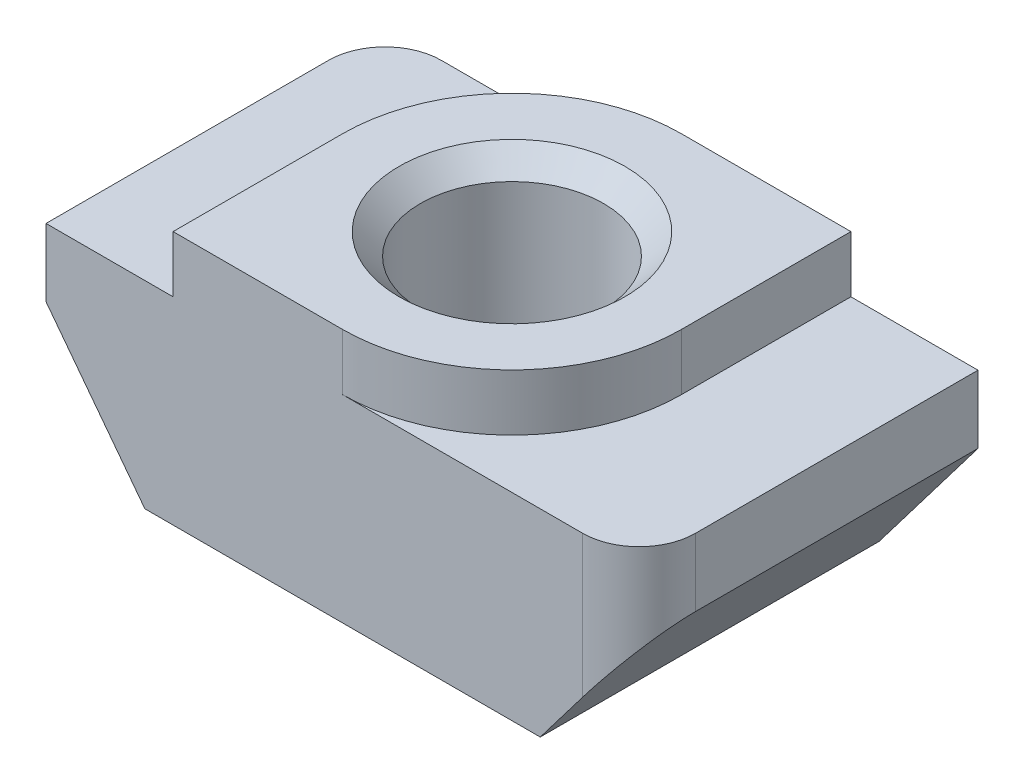
ISO-10303-21;
HEADER;
FILE_DESCRIPTION(('STEP AP214'),'2;1');
FILE_NAME('part.step','',(''),(''),'','','');
FILE_SCHEMA(('AUTOMOTIVE_DESIGN { 1 0 10303 214 1 1 1 1 }'));
ENDSEC;
DATA;
#1=APPLICATION_CONTEXT('core data for automotive mechanical design processes');
#2=APPLICATION_PROTOCOL_DEFINITION('international standard','automotive_design',2000,#1);
#3=PRODUCT_CONTEXT('',#1,'mechanical');
#4=PRODUCT('Part','Part','',(#3));
#5=PRODUCT_RELATED_PRODUCT_CATEGORY('part','',(#4));
#6=PRODUCT_DEFINITION_FORMATION('','',#4);
#7=PRODUCT_DEFINITION_CONTEXT('part definition',#1,'design');
#8=PRODUCT_DEFINITION('design','',#6,#7);
#9=PRODUCT_DEFINITION_SHAPE('','',#8);
#10=(LENGTH_UNIT() NAMED_UNIT(*) SI_UNIT(.MILLI.,.METRE.));
#11=(NAMED_UNIT(*) PLANE_ANGLE_UNIT() SI_UNIT($,.RADIAN.));
#12=(NAMED_UNIT(*) SI_UNIT($,.STERADIAN.) SOLID_ANGLE_UNIT());
#13=UNCERTAINTY_MEASURE_WITH_UNIT(LENGTH_MEASURE(1.E-05),#10,'distance_accuracy_value','');
#14=(GEOMETRIC_REPRESENTATION_CONTEXT(3) GLOBAL_UNCERTAINTY_ASSIGNED_CONTEXT((#13)) GLOBAL_UNIT_ASSIGNED_CONTEXT((#10,
#11,#12)) REPRESENTATION_CONTEXT('',''));
#15=CARTESIAN_POINT('',(0.,0.,0.));
#16=DIRECTION('',(0.,0.,1.));
#17=DIRECTION('',(1.,0.,0.));
#18=AXIS2_PLACEMENT_3D('',#15,#16,#17);
#19=CARTESIAN_POINT('',(-5.25,0.,3.));
#20=DIRECTION('',(1.,0.,0.));
#21=DIRECTION('',(0.,0.,-1.));
#22=AXIS2_PLACEMENT_3D('',#19,#20,#21);
#23=PLANE('',#22);
#24=DIRECTION('',(0.,1.,0.));
#25=VECTOR('',#24,1.);
#26=CARTESIAN_POINT('',(-5.25,0.,-2.));
#27=LINE('',#26,#25);
#28=CARTESIAN_POINT('',(-5.25,-1.2,-2.));
#29=VERTEX_POINT('',#28);
#30=CARTESIAN_POINT('',(-5.25,0.,-2.));
#31=VERTEX_POINT('',#30);
#32=EDGE_CURVE('E212',#29,#31,#27,.T.);
#33=ORIENTED_EDGE('',*,*,#32,.F.);
#34=DIRECTION('',(0.,0.,1.));
#35=VECTOR('',#34,1.);
#36=CARTESIAN_POINT('',(-5.25,-1.2,3.));
#37=LINE('',#36,#35);
#38=CARTESIAN_POINT('',(-5.25,-1.2,3.));
#39=VERTEX_POINT('',#38);
#40=EDGE_CURVE('E155',#29,#39,#37,.T.);
#41=ORIENTED_EDGE('',*,*,#40,.T.);
#42=DIRECTION('',(0.,1.,0.));
#43=VECTOR('',#42,1.);
#44=CARTESIAN_POINT('',(-5.25,0.,3.));
#45=LINE('',#44,#43);
#46=CARTESIAN_POINT('',(-5.25,0.,3.));
#47=VERTEX_POINT('',#46);
#48=EDGE_CURVE('E144',#47,#39,#45,.F.);
#49=ORIENTED_EDGE('',*,*,#48,.F.);
#50=DIRECTION('',(0.,0.,-1.));
#51=VECTOR('',#50,1.);
#52=CARTESIAN_POINT('',(-5.25,0.,3.));
#53=LINE('',#52,#51);
#54=EDGE_CURVE('E134',#47,#31,#53,.T.);
#55=ORIENTED_EDGE('',*,*,#54,.T.);
#56=EDGE_LOOP('',(#33,#41,#49,#55));
#57=FACE_BOUND('',#56,.T.);
#58=ADVANCED_FACE('F16',(#57),#23,.F.);
#59=CARTESIAN_POINT('',(4.25,0.,2.));
#60=DIRECTION('',(0.,1.,0.));
#61=DIRECTION('',(0.,0.,1.));
#62=AXIS2_PLACEMENT_3D('',#59,#60,#61);
#63=CYLINDRICAL_SURFACE('',#62,1.);
#64=CARTESIAN_POINT('',(4.25,0.,2.));
#65=DIRECTION('',(0.,1.,0.));
#66=DIRECTION('',(0.,0.,1.));
#67=AXIS2_PLACEMENT_3D('',#64,#65,#66);
#68=CIRCLE('',#67,1.);
#69=CARTESIAN_POINT('',(5.25,0.,2.));
#70=VERTEX_POINT('',#69);
#71=CARTESIAN_POINT('',(4.25,0.,3.));
#72=VERTEX_POINT('',#71);
#73=EDGE_CURVE('E19',#70,#72,#68,.F.);
#74=ORIENTED_EDGE('',*,*,#73,.T.);
#75=DIRECTION('',(0.,1.,0.));
#76=VECTOR('',#75,1.);
#77=CARTESIAN_POINT('',(4.25,0.,3.));
#78=LINE('',#77,#76);
#79=CARTESIAN_POINT('',(4.25,-2.51428571428572,3.));
#80=VERTEX_POINT('',#79);
#81=EDGE_CURVE('E152',#80,#72,#78,.T.);
#82=ORIENTED_EDGE('',*,*,#81,.F.);
#83=CARTESIAN_POINT('',(4.25,-2.51428571428572,2.));
#84=DIRECTION('',(-0.795828694120859,0.605521832483263,0.));
#85=DIRECTION('',(0.605521832483263,0.795828694120859,0.));
#86=AXIS2_PLACEMENT_3D('',#83,#84,#85);
#87=ELLIPSE('',#86,1.65146811618496,1.);
#88=CARTESIAN_POINT('',(5.25,-1.2,2.));
#89=VERTEX_POINT('',#88);
#90=EDGE_CURVE('E119',#80,#89,#87,.T.);
#91=ORIENTED_EDGE('',*,*,#90,.T.);
#92=DIRECTION('',(0.,1.,0.));
#93=VECTOR('',#92,1.);
#94=CARTESIAN_POINT('',(5.25,-1.2,2.));
#95=LINE('',#94,#93);
#96=EDGE_CURVE('E114',#89,#70,#95,.T.);
#97=ORIENTED_EDGE('',*,*,#96,.T.);
#98=EDGE_LOOP('',(#74,#82,#91,#97));
#99=FACE_BOUND('',#98,.T.);
#100=ADVANCED_FACE('F116',(#99),#63,.T.);
#101=CARTESIAN_POINT('',(5.25,-1.2,3.));
#102=DIRECTION('',(-1.,0.,0.));
#103=DIRECTION('',(0.,0.,1.));
#104=AXIS2_PLACEMENT_3D('',#101,#102,#103);
#105=PLANE('',#104);
#106=ORIENTED_EDGE('',*,*,#96,.F.);
#107=DIRECTION('',(0.,0.,1.));
#108=VECTOR('',#107,1.);
#109=CARTESIAN_POINT('',(5.25,-1.2,3.));
#110=LINE('',#109,#108);
#111=CARTESIAN_POINT('',(5.25,-1.2,-3.));
#112=VERTEX_POINT('',#111);
#113=EDGE_CURVE('E149',#89,#112,#110,.F.);
#114=ORIENTED_EDGE('',*,*,#113,.T.);
#115=DIRECTION('',(0.,1.,0.));
#116=VECTOR('',#115,1.);
#117=CARTESIAN_POINT('',(5.25,-1.2,-3.));
#118=LINE('',#117,#116);
#119=CARTESIAN_POINT('',(5.25,0.,-3.));
#120=VERTEX_POINT('',#119);
#121=EDGE_CURVE('E125',#120,#112,#118,.F.);
#122=ORIENTED_EDGE('',*,*,#121,.F.);
#123=DIRECTION('',(0.,0.,-1.));
#124=VECTOR('',#123,1.);
#125=CARTESIAN_POINT('',(5.25,0.,3.));
#126=LINE('',#125,#124);
#127=EDGE_CURVE('E124',#120,#70,#126,.F.);
#128=ORIENTED_EDGE('',*,*,#127,.T.);
#129=EDGE_LOOP('',(#106,#114,#122,#128));
#130=FACE_BOUND('',#129,.T.);
#131=ADVANCED_FACE('F135',(#130),#105,.F.);
#132=CARTESIAN_POINT('',(5.25,0.,3.));
#133=DIRECTION('',(0.,-1.,0.));
#134=DIRECTION('',(0.,0.,-1.));
#135=AXIS2_PLACEMENT_3D('',#132,#133,#134);
#136=PLANE('',#135);
#137=ORIENTED_EDGE('',*,*,#73,.F.);
#138=ORIENTED_EDGE('',*,*,#127,.F.);
#139=DIRECTION('',(1.,0.,0.));
#140=VECTOR('',#139,1.);
#141=CARTESIAN_POINT('',(0.,0.,-3.));
#142=LINE('',#141,#140);
#143=CARTESIAN_POINT('',(3.,0.,-3.));
#144=VERTEX_POINT('',#143);
#145=EDGE_CURVE('E148',#120,#144,#142,.F.);
#146=ORIENTED_EDGE('',*,*,#145,.T.);
#147=DIRECTION('',(0.,0.,1.));
#148=VECTOR('',#147,1.);
#149=CARTESIAN_POINT('',(3.,0.,0.));
#150=LINE('',#149,#148);
#151=CARTESIAN_POINT('',(3.,0.,0.));
#152=VERTEX_POINT('',#151);
#153=EDGE_CURVE('E208',#144,#152,#150,.T.);
#154=ORIENTED_EDGE('',*,*,#153,.T.);
#155=CARTESIAN_POINT('',(0.,0.,0.));
#156=DIRECTION('',(0.,1.,0.));
#157=DIRECTION('',(0.,0.,1.));
#158=AXIS2_PLACEMENT_3D('',#155,#156,#157);
#159=CIRCLE('',#158,3.);
#160=CARTESIAN_POINT('',(0.,0.,3.));
#161=VERTEX_POINT('',#160);
#162=EDGE_CURVE('E171',#161,#152,#159,.T.);
#163=ORIENTED_EDGE('',*,*,#162,.F.);
#164=DIRECTION('',(1.,0.,0.));
#165=VECTOR('',#164,1.);
#166=CARTESIAN_POINT('',(0.,0.,3.));
#167=LINE('',#166,#165);
#168=EDGE_CURVE('E133',#72,#161,#167,.F.);
#169=ORIENTED_EDGE('',*,*,#168,.F.);
#170=EDGE_LOOP('',(#137,#138,#146,#154,#163,#169));
#171=FACE_BOUND('',#170,.T.);
#172=ADVANCED_FACE('F129',(#171),#136,.F.);
#173=CARTESIAN_POINT('',(5.25,0.,3.));
#174=DIRECTION('',(0.,-1.,0.));
#175=DIRECTION('',(0.,0.,-1.));
#176=AXIS2_PLACEMENT_3D('',#173,#174,#175);
#177=PLANE('',#176);
#178=CARTESIAN_POINT('',(-4.25,0.,-2.));
#179=DIRECTION('',(0.,1.,0.));
#180=DIRECTION('',(0.,0.,1.));
#181=AXIS2_PLACEMENT_3D('',#178,#179,#180);
#182=CIRCLE('',#181,1.);
#183=CARTESIAN_POINT('',(-4.25,0.,-3.));
#184=VERTEX_POINT('',#183);
#185=EDGE_CURVE('E213',#31,#184,#182,.F.);
#186=ORIENTED_EDGE('',*,*,#185,.F.);
#187=ORIENTED_EDGE('',*,*,#54,.F.);
#188=DIRECTION('',(1.,0.,0.));
#189=VECTOR('',#188,1.);
#190=CARTESIAN_POINT('',(0.,0.,3.));
#191=LINE('',#190,#189);
#192=CARTESIAN_POINT('',(-3.,0.,3.));
#193=VERTEX_POINT('',#192);
#194=EDGE_CURVE('E175',#193,#47,#191,.F.);
#195=ORIENTED_EDGE('',*,*,#194,.F.);
#196=DIRECTION('',(0.,0.,-1.));
#197=VECTOR('',#196,1.);
#198=CARTESIAN_POINT('',(-3.,0.,0.));
#199=LINE('',#198,#197);
#200=CARTESIAN_POINT('',(-3.,0.,0.));
#201=VERTEX_POINT('',#200);
#202=EDGE_CURVE('E168',#193,#201,#199,.T.);
#203=ORIENTED_EDGE('',*,*,#202,.T.);
#204=CARTESIAN_POINT('',(0.,0.,0.));
#205=DIRECTION('',(0.,1.,0.));
#206=DIRECTION('',(0.,0.,1.));
#207=AXIS2_PLACEMENT_3D('',#204,#205,#206);
#208=CIRCLE('',#207,3.);
#209=CARTESIAN_POINT('',(0.,0.,-3.));
#210=VERTEX_POINT('',#209);
#211=EDGE_CURVE('E211',#210,#201,#208,.T.);
#212=ORIENTED_EDGE('',*,*,#211,.F.);
#213=DIRECTION('',(1.,0.,0.));
#214=VECTOR('',#213,1.);
#215=CARTESIAN_POINT('',(0.,0.,-3.));
#216=LINE('',#215,#214);
#217=EDGE_CURVE('E225',#210,#184,#216,.F.);
#218=ORIENTED_EDGE('',*,*,#217,.T.);
#219=EDGE_LOOP('',(#186,#187,#195,#203,#212,#218));
#220=FACE_BOUND('',#219,.T.);
#221=ADVANCED_FACE('F296',(#220),#177,.F.);
#222=CARTESIAN_POINT('',(-4.25,0.,-2.));
#223=DIRECTION('',(0.,1.,0.));
#224=DIRECTION('',(0.,0.,1.));
#225=AXIS2_PLACEMENT_3D('',#222,#223,#224);
#226=CYLINDRICAL_SURFACE('',#225,1.);
#227=CARTESIAN_POINT('',(-4.25,-2.51428571428571,-2.));
#228=DIRECTION('',(0.795828694120859,0.605521832483263,0.));
#229=DIRECTION('',(-0.605521832483263,0.795828694120859,0.));
#230=AXIS2_PLACEMENT_3D('',#227,#228,#229);
#231=ELLIPSE('',#230,1.65146811618496,1.);
#232=CARTESIAN_POINT('',(-4.25,-2.51428571428572,-3.));
#233=VERTEX_POINT('',#232);
#234=EDGE_CURVE('E205',#233,#29,#231,.T.);
#235=ORIENTED_EDGE('',*,*,#234,.T.);
#236=ORIENTED_EDGE('',*,*,#32,.T.);
#237=ORIENTED_EDGE('',*,*,#185,.T.);
#238=DIRECTION('',(0.,1.,0.));
#239=VECTOR('',#238,1.);
#240=CARTESIAN_POINT('',(-4.25,0.,-3.));
#241=LINE('',#240,#239);
#242=EDGE_CURVE('E254',#184,#233,#241,.F.);
#243=ORIENTED_EDGE('',*,*,#242,.T.);
#244=EDGE_LOOP('',(#235,#236,#237,#243));
#245=FACE_BOUND('',#244,.T.);
#246=ADVANCED_FACE('F437',(#245),#226,.T.);
#247=CARTESIAN_POINT('',(0.,1.,0.));
#248=DIRECTION('',(0.,1.,0.));
#249=DIRECTION('',(0.,0.,1.));
#250=AXIS2_PLACEMENT_3D('',#247,#248,#249);
#251=CYLINDRICAL_SURFACE('',#250,3.);
#252=CARTESIAN_POINT('',(0.,1.,0.));
#253=DIRECTION('',(0.,1.,0.));
#254=DIRECTION('',(0.,0.,1.));
#255=AXIS2_PLACEMENT_3D('',#252,#253,#254);
#256=CIRCLE('',#255,3.);
#257=CARTESIAN_POINT('',(0.,1.,-3.));
#258=VERTEX_POINT('',#257);
#259=CARTESIAN_POINT('',(-3.,1.,0.));
#260=VERTEX_POINT('',#259);
#261=EDGE_CURVE('E200',#258,#260,#256,.T.);
#262=ORIENTED_EDGE('',*,*,#261,.F.);
#263=DIRECTION('',(0.,1.,0.));
#264=VECTOR('',#263,1.);
#265=CARTESIAN_POINT('',(0.,0.,-3.));
#266=LINE('',#265,#264);
#267=EDGE_CURVE('E233',#258,#210,#266,.F.);
#268=ORIENTED_EDGE('',*,*,#267,.T.);
#269=ORIENTED_EDGE('',*,*,#211,.T.);
#270=DIRECTION('',(0.,1.,0.));
#271=VECTOR('',#270,1.);
#272=CARTESIAN_POINT('',(-3.,1.,0.));
#273=LINE('',#272,#271);
#274=EDGE_CURVE('E172',#201,#260,#273,.T.);
#275=ORIENTED_EDGE('',*,*,#274,.T.);
#276=EDGE_LOOP('',(#262,#268,#269,#275));
#277=FACE_BOUND('',#276,.T.);
#278=ADVANCED_FACE('F302',(#277),#251,.T.);
#279=CARTESIAN_POINT('',(-3.,1.,0.));
#280=DIRECTION('',(1.,0.,0.));
#281=DIRECTION('',(0.,0.,-1.));
#282=AXIS2_PLACEMENT_3D('',#279,#280,#281);
#283=PLANE('',#282);
#284=DIRECTION('',(0.,1.,0.));
#285=VECTOR('',#284,1.);
#286=CARTESIAN_POINT('',(-3.,0.,3.));
#287=LINE('',#286,#285);
#288=CARTESIAN_POINT('',(-3.,1.,3.));
#289=VERTEX_POINT('',#288);
#290=EDGE_CURVE('E179',#289,#193,#287,.F.);
#291=ORIENTED_EDGE('',*,*,#290,.F.);
#292=DIRECTION('',(0.,0.,1.));
#293=VECTOR('',#292,1.);
#294=CARTESIAN_POINT('',(-3.,1.,0.));
#295=LINE('',#294,#293);
#296=EDGE_CURVE('E202',#260,#289,#295,.T.);
#297=ORIENTED_EDGE('',*,*,#296,.F.);
#298=ORIENTED_EDGE('',*,*,#274,.F.);
#299=ORIENTED_EDGE('',*,*,#202,.F.);
#300=EDGE_LOOP('',(#291,#297,#298,#299));
#301=FACE_BOUND('',#300,.T.);
#302=ADVANCED_FACE('F337',(#301),#283,.F.);
#303=CARTESIAN_POINT('',(0.,1.,0.));
#304=DIRECTION('',(0.,1.,0.));
#305=DIRECTION('',(0.,0.,1.));
#306=AXIS2_PLACEMENT_3D('',#303,#304,#305);
#307=CYLINDRICAL_SURFACE('',#306,3.);
#308=CARTESIAN_POINT('',(0.,1.,0.));
#309=DIRECTION('',(0.,1.,0.));
#310=DIRECTION('',(0.,0.,1.));
#311=AXIS2_PLACEMENT_3D('',#308,#309,#310);
#312=CIRCLE('',#311,3.);
#313=CARTESIAN_POINT('',(0.,1.,3.));
#314=VERTEX_POINT('',#313);
#315=CARTESIAN_POINT('',(3.,1.,0.));
#316=VERTEX_POINT('',#315);
#317=EDGE_CURVE('E196',#314,#316,#312,.T.);
#318=ORIENTED_EDGE('',*,*,#317,.F.);
#319=DIRECTION('',(0.,1.,0.));
#320=VECTOR('',#319,1.);
#321=CARTESIAN_POINT('',(0.,0.,3.));
#322=LINE('',#321,#320);
#323=EDGE_CURVE('E183',#161,#314,#322,.T.);
#324=ORIENTED_EDGE('',*,*,#323,.F.);
#325=ORIENTED_EDGE('',*,*,#162,.T.);
#326=DIRECTION('',(0.,1.,0.));
#327=VECTOR('',#326,1.);
#328=CARTESIAN_POINT('',(3.,1.,0.));
#329=LINE('',#328,#327);
#330=EDGE_CURVE('E210',#152,#316,#329,.T.);
#331=ORIENTED_EDGE('',*,*,#330,.T.);
#332=EDGE_LOOP('',(#318,#324,#325,#331));
#333=FACE_BOUND('',#332,.T.);
#334=ADVANCED_FACE('F326',(#333),#307,.T.);
#335=CARTESIAN_POINT('',(3.,1.,0.));
#336=DIRECTION('',(-1.,0.,0.));
#337=DIRECTION('',(0.,0.,1.));
#338=AXIS2_PLACEMENT_3D('',#335,#336,#337);
#339=PLANE('',#338);
#340=DIRECTION('',(0.,1.,0.));
#341=VECTOR('',#340,1.);
#342=CARTESIAN_POINT('',(3.,0.,-3.));
#343=LINE('',#342,#341);
#344=CARTESIAN_POINT('',(3.,1.,-3.));
#345=VERTEX_POINT('',#344);
#346=EDGE_CURVE('E231',#144,#345,#343,.T.);
#347=ORIENTED_EDGE('',*,*,#346,.T.);
#348=DIRECTION('',(0.,0.,1.));
#349=VECTOR('',#348,1.);
#350=CARTESIAN_POINT('',(3.,1.,0.));
#351=LINE('',#350,#349);
#352=EDGE_CURVE('E198',#316,#345,#351,.F.);
#353=ORIENTED_EDGE('',*,*,#352,.F.);
#354=ORIENTED_EDGE('',*,*,#330,.F.);
#355=ORIENTED_EDGE('',*,*,#153,.F.);
#356=EDGE_LOOP('',(#347,#353,#354,#355));
#357=FACE_BOUND('',#356,.T.);
#358=ADVANCED_FACE('F328',(#357),#339,.F.);
#359=CARTESIAN_POINT('',(-5.25,-1.2,3.));
#360=DIRECTION('',(0.795828694120859,0.605521832483263,0.));
#361=DIRECTION('',(-0.605521832483263,0.795828694120859,0.));
#362=AXIS2_PLACEMENT_3D('',#359,#360,#361);
#363=PLANE('',#362);
#364=ORIENTED_EDGE('',*,*,#234,.F.);
#365=DIRECTION('',(0.605521832483265,-0.795828694120857,0.));
#366=VECTOR('',#365,1.);
#367=CARTESIAN_POINT('',(-4.25,-2.51428571428572,-3.));
#368=LINE('',#367,#366);
#369=CARTESIAN_POINT('',(-3.5,-3.5,-3.));
#370=VERTEX_POINT('',#369);
#371=EDGE_CURVE('E203',#233,#370,#368,.T.);
#372=ORIENTED_EDGE('',*,*,#371,.T.);
#373=DIRECTION('',(0.,0.,1.));
#374=VECTOR('',#373,1.);
#375=CARTESIAN_POINT('',(-3.5,-3.5,3.));
#376=LINE('',#375,#374);
#377=CARTESIAN_POINT('',(-3.5,-3.5,3.));
#378=VERTEX_POINT('',#377);
#379=EDGE_CURVE('E165',#370,#378,#376,.T.);
#380=ORIENTED_EDGE('',*,*,#379,.T.);
#381=DIRECTION('',(0.605521832483262,-0.795828694120859,0.));
#382=VECTOR('',#381,1.);
#383=CARTESIAN_POINT('',(-5.25,-1.2,3.));
#384=LINE('',#383,#382);
#385=EDGE_CURVE('E178',#39,#378,#384,.T.);
#386=ORIENTED_EDGE('',*,*,#385,.F.);
#387=ORIENTED_EDGE('',*,*,#40,.F.);
#388=EDGE_LOOP('',(#364,#372,#380,#386,#387));
#389=FACE_BOUND('',#388,.T.);
#390=ADVANCED_FACE('F290',(#389),#363,.F.);
#391=CARTESIAN_POINT('',(0.,0.,3.));
#392=DIRECTION('',(0.,0.,1.));
#393=DIRECTION('',(1.,0.,0.));
#394=AXIS2_PLACEMENT_3D('',#391,#392,#393);
#395=PLANE('',#394);
#396=ORIENTED_EDGE('',*,*,#385,.T.);
#397=DIRECTION('',(1.,0.,0.));
#398=VECTOR('',#397,1.);
#399=CARTESIAN_POINT('',(-3.5,-3.5,3.));
#400=LINE('',#399,#398);
#401=CARTESIAN_POINT('',(3.5,-3.5,3.));
#402=VERTEX_POINT('',#401);
#403=EDGE_CURVE('E160',#378,#402,#400,.T.);
#404=ORIENTED_EDGE('',*,*,#403,.T.);
#405=DIRECTION('',(-0.605521832483263,-0.795828694120859,0.));
#406=VECTOR('',#405,1.);
#407=CARTESIAN_POINT('',(3.5,-3.5,3.));
#408=LINE('',#407,#406);
#409=EDGE_CURVE('E188',#402,#80,#408,.F.);
#410=ORIENTED_EDGE('',*,*,#409,.T.);
#411=ORIENTED_EDGE('',*,*,#81,.T.);
#412=ORIENTED_EDGE('',*,*,#168,.T.);
#413=ORIENTED_EDGE('',*,*,#323,.T.);
#414=DIRECTION('',(1.,0.,0.));
#415=VECTOR('',#414,1.);
#416=CARTESIAN_POINT('',(0.,1.,3.));
#417=LINE('',#416,#415);
#418=EDGE_CURVE('E199',#289,#314,#417,.T.);
#419=ORIENTED_EDGE('',*,*,#418,.F.);
#420=ORIENTED_EDGE('',*,*,#290,.T.);
#421=ORIENTED_EDGE('',*,*,#194,.T.);
#422=ORIENTED_EDGE('',*,*,#48,.T.);
#423=EDGE_LOOP('',(#396,#404,#410,#411,#412,#413,#419,#420,#421,#422));
#424=FACE_BOUND('',#423,.T.);
#425=ADVANCED_FACE('F291',(#424),#395,.T.);
#426=CARTESIAN_POINT('',(3.5,-3.5,3.));
#427=DIRECTION('',(-0.795828694120859,0.605521832483263,0.));
#428=DIRECTION('',(-0.605521832483263,-0.795828694120859,0.));
#429=AXIS2_PLACEMENT_3D('',#426,#427,#428);
#430=PLANE('',#429);
#431=ORIENTED_EDGE('',*,*,#90,.F.);
#432=ORIENTED_EDGE('',*,*,#409,.F.);
#433=DIRECTION('',(0.,0.,1.));
#434=VECTOR('',#433,1.);
#435=CARTESIAN_POINT('',(3.5,-3.5,3.));
#436=LINE('',#435,#434);
#437=CARTESIAN_POINT('',(3.5,-3.5,-3.));
#438=VERTEX_POINT('',#437);
#439=EDGE_CURVE('E156',#402,#438,#436,.F.);
#440=ORIENTED_EDGE('',*,*,#439,.T.);
#441=DIRECTION('',(0.605521832483262,0.795828694120859,0.));
#442=VECTOR('',#441,1.);
#443=CARTESIAN_POINT('',(3.5,-3.5,-3.));
#444=LINE('',#443,#442);
#445=EDGE_CURVE('E34',#438,#112,#444,.T.);
#446=ORIENTED_EDGE('',*,*,#445,.T.);
#447=ORIENTED_EDGE('',*,*,#113,.F.);
#448=EDGE_LOOP('',(#431,#432,#440,#446,#447));
#449=FACE_BOUND('',#448,.T.);
#450=ADVANCED_FACE('F275',(#449),#430,.F.);
#451=CARTESIAN_POINT('',(0.,0.,-3.));
#452=DIRECTION('',(0.,0.,1.));
#453=DIRECTION('',(1.,0.,0.));
#454=AXIS2_PLACEMENT_3D('',#451,#452,#453);
#455=PLANE('',#454);
#456=ORIENTED_EDGE('',*,*,#242,.F.);
#457=ORIENTED_EDGE('',*,*,#217,.F.);
#458=ORIENTED_EDGE('',*,*,#267,.F.);
#459=DIRECTION('',(1.,0.,0.));
#460=VECTOR('',#459,1.);
#461=CARTESIAN_POINT('',(0.,1.,-3.));
#462=LINE('',#461,#460);
#463=EDGE_CURVE('E262',#345,#258,#462,.F.);
#464=ORIENTED_EDGE('',*,*,#463,.F.);
#465=ORIENTED_EDGE('',*,*,#346,.F.);
#466=ORIENTED_EDGE('',*,*,#145,.F.);
#467=ORIENTED_EDGE('',*,*,#121,.T.);
#468=ORIENTED_EDGE('',*,*,#445,.F.);
#469=DIRECTION('',(1.,0.,0.));
#470=VECTOR('',#469,1.);
#471=CARTESIAN_POINT('',(-3.5,-3.5,-3.));
#472=LINE('',#471,#470);
#473=EDGE_CURVE('E159',#438,#370,#472,.F.);
#474=ORIENTED_EDGE('',*,*,#473,.T.);
#475=ORIENTED_EDGE('',*,*,#371,.F.);
#476=EDGE_LOOP('',(#456,#457,#458,#464,#465,#466,#467,#468,#474,#475));
#477=FACE_BOUND('',#476,.T.);
#478=ADVANCED_FACE('F268',(#477),#455,.F.);
#479=CARTESIAN_POINT('',(0.,1.,0.));
#480=DIRECTION('',(0.,1.,0.));
#481=DIRECTION('',(0.,0.,1.));
#482=AXIS2_PLACEMENT_3D('',#479,#480,#481);
#483=PLANE('',#482);
#484=ORIENTED_EDGE('',*,*,#352,.T.);
#485=ORIENTED_EDGE('',*,*,#463,.T.);
#486=ORIENTED_EDGE('',*,*,#261,.T.);
#487=ORIENTED_EDGE('',*,*,#296,.T.);
#488=ORIENTED_EDGE('',*,*,#418,.T.);
#489=ORIENTED_EDGE('',*,*,#317,.T.);
#490=EDGE_LOOP('',(#484,#485,#486,#487,#488,#489));
#491=FACE_BOUND('',#490,.T.);
#492=CARTESIAN_POINT('',(0.,1.0000000000332,0.));
#493=DIRECTION('',(0.,1.,0.));
#494=DIRECTION('',(0.,0.,1.));
#495=AXIS2_PLACEMENT_3D('',#492,#493,#494);
#496=CIRCLE('',#495,2.00000000000955);
#497=CARTESIAN_POINT('',(0.,1.0000000000332,2.00000000000955));
#498=VERTEX_POINT('',#497);
#499=EDGE_CURVE('E193',#498,#498,#496,.F.);
#500=ORIENTED_EDGE('',*,*,#499,.T.);
#501=EDGE_LOOP('',(#500));
#502=FACE_BOUND('',#501,.T.);
#503=ADVANCED_FACE('F306',(#491,#502),#483,.T.);
#504=CARTESIAN_POINT('',(-3.5,-3.5,3.));
#505=DIRECTION('',(0.,1.,0.));
#506=DIRECTION('',(0.,0.,1.));
#507=AXIS2_PLACEMENT_3D('',#504,#505,#506);
#508=PLANE('',#507);
#509=ORIENTED_EDGE('',*,*,#439,.F.);
#510=ORIENTED_EDGE('',*,*,#403,.F.);
#511=ORIENTED_EDGE('',*,*,#379,.F.);
#512=ORIENTED_EDGE('',*,*,#473,.F.);
#513=EDGE_LOOP('',(#509,#510,#511,#512));
#514=FACE_BOUND('',#513,.T.);
#515=CARTESIAN_POINT('',(0.,-3.5,0.));
#516=DIRECTION('',(0.,1.,0.));
#517=DIRECTION('',(0.,0.,1.));
#518=AXIS2_PLACEMENT_3D('',#515,#516,#517);
#519=CIRCLE('',#518,1.621);
#520=CARTESIAN_POINT('',(0.,-3.5,1.621));
#521=VERTEX_POINT('',#520);
#522=EDGE_CURVE('E25',#521,#521,#519,.T.);
#523=ORIENTED_EDGE('',*,*,#522,.T.);
#524=EDGE_LOOP('',(#523));
#525=FACE_BOUND('',#524,.T.);
#526=ADVANCED_FACE('F271',(#514,#525),#508,.F.);
#527=CARTESIAN_POINT('',(0.,1.0000000000332,0.));
#528=DIRECTION('',(0.,1.,0.));
#529=DIRECTION('',(0.,0.,1.));
#530=AXIS2_PLACEMENT_3D('',#527,#528,#529);
#531=CONICAL_SURFACE('',#530,2.00000000000955,0.785398163322457);
#532=ORIENTED_EDGE('',*,*,#499,.F.);
#533=EDGE_LOOP('',(#532));
#534=FACE_BOUND('',#533,.T.);
#535=CARTESIAN_POINT('',(0.,0.621,0.));
#536=DIRECTION('',(0.,1.,0.));
#537=DIRECTION('',(0.,0.,1.));
#538=AXIS2_PLACEMENT_3D('',#535,#536,#537);
#539=CIRCLE('',#538,1.621);
#540=CARTESIAN_POINT('',(0.,0.621,1.621));
#541=VERTEX_POINT('',#540);
#542=EDGE_CURVE('E11',#541,#541,#539,.F.);
#543=ORIENTED_EDGE('',*,*,#542,.T.);
#544=EDGE_LOOP('',(#543));
#545=FACE_BOUND('',#544,.T.);
#546=ADVANCED_FACE('F341',(#534,#545),#531,.F.);
#547=CARTESIAN_POINT('',(0.,-3.5,0.));
#548=DIRECTION('',(0.,1.,0.));
#549=DIRECTION('',(0.,0.,1.));
#550=AXIS2_PLACEMENT_3D('',#547,#548,#549);
#551=CYLINDRICAL_SURFACE('',#550,1.621);
#552=ORIENTED_EDGE('',*,*,#542,.F.);
#553=EDGE_LOOP('',(#552));
#554=FACE_BOUND('',#553,.T.);
#555=ORIENTED_EDGE('',*,*,#522,.F.);
#556=EDGE_LOOP('',(#555));
#557=FACE_BOUND('',#556,.T.);
#558=ADVANCED_FACE('F339',(#554,#557),#551,.F.);
#559=CLOSED_SHELL('',(#58,#100,#131,#172,#221,#246,#278,#302,#334,#358,#390,#425,#450,#478,#503,
#526,#546,#558));
#560=MANIFOLD_SOLID_BREP('B1',#559);
#561=ADVANCED_BREP_SHAPE_REPRESENTATION('',(#18,#560),#14);
#562=SHAPE_DEFINITION_REPRESENTATION(#9,#561);
ENDSEC;
END-ISO-10303-21;
